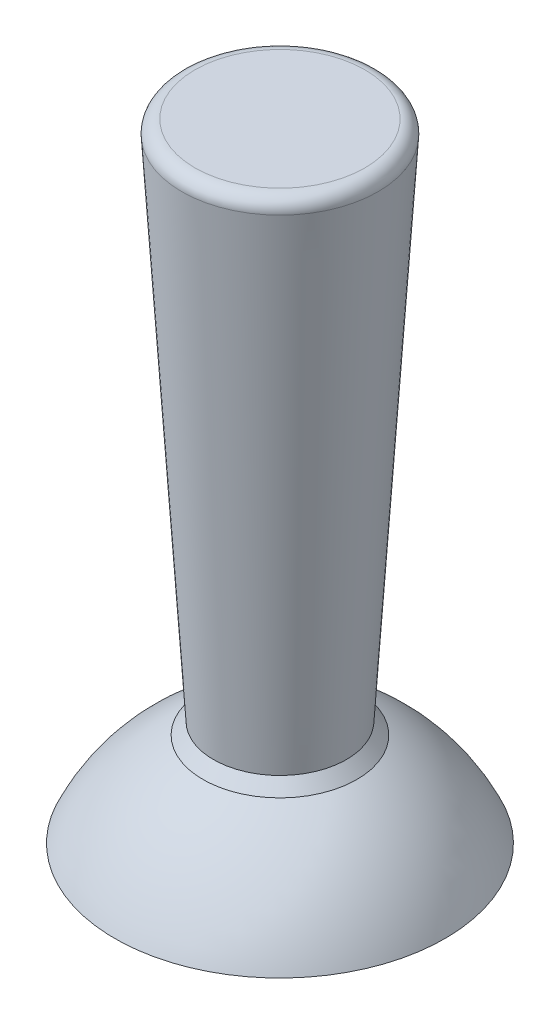
ISO-10303-21;
HEADER;
FILE_DESCRIPTION(('STEP AP214'),'2;1');
FILE_NAME('part.step','',(''),(''),'','','');
FILE_SCHEMA(('AUTOMOTIVE_DESIGN { 1 0 10303 214 1 1 1 1 }'));
ENDSEC;
DATA;
#1=APPLICATION_CONTEXT('core data for automotive mechanical design processes');
#2=APPLICATION_PROTOCOL_DEFINITION('international standard','automotive_design',2000,#1);
#3=PRODUCT_CONTEXT('',#1,'mechanical');
#4=PRODUCT('Part','Part','',(#3));
#5=PRODUCT_RELATED_PRODUCT_CATEGORY('part','',(#4));
#6=PRODUCT_DEFINITION_FORMATION('','',#4);
#7=PRODUCT_DEFINITION_CONTEXT('part definition',#1,'design');
#8=PRODUCT_DEFINITION('design','',#6,#7);
#9=PRODUCT_DEFINITION_SHAPE('','',#8);
#10=(LENGTH_UNIT() NAMED_UNIT(*) SI_UNIT(.MILLI.,.METRE.));
#11=(NAMED_UNIT(*) PLANE_ANGLE_UNIT() SI_UNIT($,.RADIAN.));
#12=(NAMED_UNIT(*) SI_UNIT($,.STERADIAN.) SOLID_ANGLE_UNIT());
#13=UNCERTAINTY_MEASURE_WITH_UNIT(LENGTH_MEASURE(1.E-05),#10,'distance_accuracy_value','');
#14=(GEOMETRIC_REPRESENTATION_CONTEXT(3) GLOBAL_UNCERTAINTY_ASSIGNED_CONTEXT((#13)) GLOBAL_UNIT_ASSIGNED_CONTEXT((#10,
#11,#12)) REPRESENTATION_CONTEXT('',''));
#15=CARTESIAN_POINT('',(0.,0.,0.));
#16=DIRECTION('',(0.,0.,1.));
#17=DIRECTION('',(1.,0.,0.));
#18=AXIS2_PLACEMENT_3D('',#15,#16,#17);
#19=CARTESIAN_POINT('',(0.,47.5,0.));
#20=DIRECTION('',(0.,1.,0.));
#21=DIRECTION('',(0.,0.,1.));
#22=AXIS2_PLACEMENT_3D('',#19,#20,#21);
#23=CONICAL_SURFACE('',#22,7.5,0.0624188099959573);
#24=CARTESIAN_POINT('',(0.,7.99902628924137,0.));
#25=DIRECTION('',(0.,-1.,0.));
#26=DIRECTION('',(0.,0.,-1.));
#27=AXIS2_PLACEMENT_3D('',#24,#25,#26);
#28=CIRCLE('',#27,5.03118914307759);
#29=CARTESIAN_POINT('',(0.,7.99902628924137,-5.03118914307759));
#30=VERTEX_POINT('',#29);
#31=EDGE_CURVE('E50',#30,#30,#28,.F.);
#32=ORIENTED_EDGE('',*,*,#31,.T.);
#33=EDGE_LOOP('',(#32));
#34=FACE_BOUND('',#33,.T.);
#35=CARTESIAN_POINT('',(0.,46.4376217138448,0.));
#36=DIRECTION('',(0.,-1.,0.));
#37=DIRECTION('',(0.,0.,-1.));
#38=AXIS2_PLACEMENT_3D('',#35,#36,#37);
#39=CIRCLE('',#38,7.4336013571153);
#40=CARTESIAN_POINT('',(0.,46.4376217138448,-7.4336013571153));
#41=VERTEX_POINT('',#40);
#42=EDGE_CURVE('E68',#41,#41,#39,.T.);
#43=ORIENTED_EDGE('',*,*,#42,.T.);
#44=EDGE_LOOP('',(#43));
#45=FACE_BOUND('',#44,.T.);
#46=ADVANCED_FACE('F37',(#34,#45),#23,.T.);
#47=CARTESIAN_POINT('',(0.,47.5,0.));
#48=DIRECTION('',(0.,-1.,0.));
#49=DIRECTION('',(0.,0.,-1.));
#50=AXIS2_PLACEMENT_3D('',#47,#48,#49);
#51=PLANE('',#50);
#52=CARTESIAN_POINT('',(0.,47.5,0.));
#53=DIRECTION('',(0.,-1.,0.));
#54=DIRECTION('',(0.,0.,-1.));
#55=AXIS2_PLACEMENT_3D('',#52,#53,#54);
#56=CIRCLE('',#55,6.43554877863241);
#57=CARTESIAN_POINT('',(0.,47.5,-6.43554877863241));
#58=VERTEX_POINT('',#57);
#59=EDGE_CURVE('E71',#58,#58,#56,.F.);
#60=ORIENTED_EDGE('',*,*,#59,.T.);
#61=EDGE_LOOP('',(#60));
#62=FACE_BOUND('',#61,.T.);
#63=ADVANCED_FACE('F91',(#62),#51,.F.);
#64=CARTESIAN_POINT('',(0.,-6.17156741649222,0.));
#65=DIRECTION('',(0.,-1.,0.));
#66=DIRECTION('',(0.,0.,-1.));
#67=AXIS2_PLACEMENT_3D('',#64,#65,#66);
#68=DEGENERATE_TOROIDAL_SURFACE('',#67,1.17156741649221,15.,.F.);
#69=CARTESIAN_POINT('',(0.,7.09445081458566,0.));
#70=DIRECTION('',(0.,-1.,0.));
#71=DIRECTION('',(0.,0.,-1.));
#72=AXIS2_PLACEMENT_3D('',#69,#70,#71);
#73=CIRCLE('',#72,5.82934397365617);
#74=CARTESIAN_POINT('',(0.,7.09445081458566,-5.82934397365617));
#75=VERTEX_POINT('',#74);
#76=EDGE_CURVE('E74',#75,#75,#73,.T.);
#77=ORIENTED_EDGE('',*,*,#76,.T.);
#78=EDGE_LOOP('',(#77));
#79=FACE_BOUND('',#78,.T.);
#80=CARTESIAN_POINT('',(0.,0.,0.));
#81=DIRECTION('',(0.,-1.,0.));
#82=DIRECTION('',(0.,0.,-1.));
#83=AXIS2_PLACEMENT_3D('',#80,#81,#82);
#84=CIRCLE('',#83,12.5);
#85=CARTESIAN_POINT('',(0.,0.,-12.5));
#86=VERTEX_POINT('',#85);
#87=EDGE_CURVE('E63',#86,#86,#84,.T.);
#88=ORIENTED_EDGE('',*,*,#87,.F.);
#89=EDGE_LOOP('',(#88));
#90=FACE_BOUND('',#89,.T.);
#91=ADVANCED_FACE('F87',(#79,#90),#68,.F.);
#92=CARTESIAN_POINT('',(0.,0.,0.));
#93=DIRECTION('',(0.,-1.,0.));
#94=DIRECTION('',(0.,0.,-1.));
#95=AXIS2_PLACEMENT_3D('',#92,#93,#94);
#96=PLANE('',#95);
#97=CARTESIAN_POINT('',(0.,0.,0.));
#98=DIRECTION('',(0.,-1.,0.));
#99=DIRECTION('',(0.,0.,-1.));
#100=AXIS2_PLACEMENT_3D('',#97,#98,#99);
#101=CIRCLE('',#100,11.3947270104139);
#102=CARTESIAN_POINT('',(0.,0.,-11.3947270104139));
#103=VERTEX_POINT('',#102);
#104=EDGE_CURVE('E58',#103,#103,#101,.T.);
#105=ORIENTED_EDGE('',*,*,#104,.F.);
#106=EDGE_LOOP('',(#105));
#107=FACE_BOUND('',#106,.T.);
#108=ORIENTED_EDGE('',*,*,#87,.T.);
#109=EDGE_LOOP('',(#108));
#110=FACE_BOUND('',#109,.T.);
#111=ADVANCED_FACE('F90',(#107,#110),#96,.T.);
#112=CARTESIAN_POINT('',(0.,6.5,0.));
#113=DIRECTION('',(0.,1.,0.));
#114=DIRECTION('',(0.,0.,1.));
#115=AXIS2_PLACEMENT_3D('',#112,#113,#114);
#116=PLANE('',#115);
#117=CARTESIAN_POINT('',(0.,6.5,0.));
#118=DIRECTION('',(0.,1.,0.));
#119=DIRECTION('',(0.,0.,1.));
#120=AXIS2_PLACEMENT_3D('',#117,#118,#119);
#121=CIRCLE('',#120,4.25);
#122=CARTESIAN_POINT('',(0.,6.5,4.25));
#123=VERTEX_POINT('',#122);
#124=EDGE_CURVE('E10',#123,#123,#121,.F.);
#125=ORIENTED_EDGE('',*,*,#124,.F.);
#126=EDGE_LOOP('',(#125));
#127=FACE_BOUND('',#126,.T.);
#128=CARTESIAN_POINT('',(0.,6.5,0.));
#129=DIRECTION('',(0.,1.,0.));
#130=DIRECTION('',(0.,0.,1.));
#131=AXIS2_PLACEMENT_3D('',#128,#129,#130);
#132=CIRCLE('',#131,4.7808589131059);
#133=CARTESIAN_POINT('',(0.,6.5,4.7808589131059));
#134=VERTEX_POINT('',#133);
#135=EDGE_CURVE('E60',#134,#134,#132,.F.);
#136=ORIENTED_EDGE('',*,*,#135,.T.);
#137=EDGE_LOOP('',(#136));
#138=FACE_BOUND('',#137,.T.);
#139=ADVANCED_FACE('F96',(#127,#138),#116,.F.);
#140=CARTESIAN_POINT('',(0.,-6.17156741649222,0.));
#141=DIRECTION('',(0.,-1.,0.));
#142=DIRECTION('',(0.,0.,-1.));
#143=AXIS2_PLACEMENT_3D('',#140,#141,#142);
#144=DEGENERATE_TOROIDAL_SURFACE('',#143,1.17156741649221,14.,.F.);
#145=ORIENTED_EDGE('',*,*,#135,.F.);
#146=EDGE_LOOP('',(#145));
#147=FACE_BOUND('',#146,.T.);
#148=ORIENTED_EDGE('',*,*,#104,.T.);
#149=EDGE_LOOP('',(#148));
#150=FACE_BOUND('',#149,.T.);
#151=ADVANCED_FACE('F102',(#147,#150),#144,.T.);
#152=CARTESIAN_POINT('',(0.,46.5,0.));
#153=DIRECTION('',(0.,-1.,0.));
#154=DIRECTION('',(0.,0.,-1.));
#155=AXIS2_PLACEMENT_3D('',#152,#153,#154);
#156=TOROIDAL_SURFACE('',#155,6.43554877863241,1.);
#157=ORIENTED_EDGE('',*,*,#59,.F.);
#158=EDGE_LOOP('',(#157));
#159=FACE_BOUND('',#158,.T.);
#160=ORIENTED_EDGE('',*,*,#42,.F.);
#161=EDGE_LOOP('',(#160));
#162=FACE_BOUND('',#161,.T.);
#163=ADVANCED_FACE('F84',(#159,#162),#156,.T.);
#164=CARTESIAN_POINT('',(0.,7.0944508145856,0.));
#165=DIRECTION('',(0.,-1.,0.));
#166=DIRECTION('',(0.,0.,-1.));
#167=AXIS2_PLACEMENT_3D('',#164,#165,#166);
#168=CONICAL_SURFACE('',#167,5.82934397365622,0.722979353401505);
#169=ORIENTED_EDGE('',*,*,#31,.F.);
#170=EDGE_LOOP('',(#169));
#171=FACE_BOUND('',#170,.T.);
#172=ORIENTED_EDGE('',*,*,#76,.F.);
#173=EDGE_LOOP('',(#172));
#174=FACE_BOUND('',#173,.T.);
#175=ADVANCED_FACE('F40',(#171,#174),#168,.T.);
#176=CARTESIAN_POINT('',(0.,4.5,0.));
#177=DIRECTION('',(0.,1.,0.));
#178=DIRECTION('',(-1.,0.,0.));
#179=AXIS2_PLACEMENT_3D('',#176,#177,#178);
#180=CONICAL_SURFACE('',#179,2.75,0.643501108793285);
#181=CARTESIAN_POINT('',(0.,4.5,0.));
#182=DIRECTION('',(0.,1.,0.));
#183=DIRECTION('',(-1.,0.,0.));
#184=AXIS2_PLACEMENT_3D('',#181,#182,#183);
#185=CIRCLE('',#184,2.75);
#186=CARTESIAN_POINT('',(-2.75,4.5,0.));
#187=VERTEX_POINT('',#186);
#188=EDGE_CURVE('E42',#187,#187,#185,.T.);
#189=ORIENTED_EDGE('',*,*,#188,.T.);
#190=EDGE_LOOP('',(#189));
#191=FACE_BOUND('',#190,.T.);
#192=ORIENTED_EDGE('',*,*,#124,.T.);
#193=EDGE_LOOP('',(#192));
#194=FACE_BOUND('',#193,.T.);
#195=ADVANCED_FACE('F83',(#191,#194),#180,.T.);
#196=CARTESIAN_POINT('',(0.,1.5,0.));
#197=DIRECTION('',(0.,-1.,0.));
#198=DIRECTION('',(0.,0.,-1.));
#199=AXIS2_PLACEMENT_3D('',#196,#197,#198);
#200=PLANE('',#199);
#201=CARTESIAN_POINT('',(0.,1.5,0.));
#202=DIRECTION('',(0.,-1.,0.));
#203=DIRECTION('',(1.,0.,0.));
#204=AXIS2_PLACEMENT_3D('',#201,#202,#203);
#205=ELLIPSE('',#204,2.2,1.7);
#206=CARTESIAN_POINT('',(2.2,1.5,0.));
#207=VERTEX_POINT('',#206);
#208=EDGE_CURVE('E53',#207,#207,#205,.T.);
#209=ORIENTED_EDGE('',*,*,#208,.F.);
#210=EDGE_LOOP('',(#209));
#211=FACE_BOUND('',#210,.T.);
#212=CARTESIAN_POINT('',(0.,1.5,0.));
#213=DIRECTION('',(0.,-1.,0.));
#214=DIRECTION('',(0.,0.,-1.));
#215=AXIS2_PLACEMENT_3D('',#212,#213,#214);
#216=CIRCLE('',#215,2.75);
#217=CARTESIAN_POINT('',(0.,1.5,-2.75));
#218=VERTEX_POINT('',#217);
#219=EDGE_CURVE('E55',#218,#218,#216,.T.);
#220=ORIENTED_EDGE('',*,*,#219,.T.);
#221=EDGE_LOOP('',(#220));
#222=FACE_BOUND('',#221,.T.);
#223=ADVANCED_FACE('F142',(#211,#222),#200,.T.);
#224=CARTESIAN_POINT('',(0.,7.5,0.));
#225=DIRECTION('',(0.,-1.,0.));
#226=DIRECTION('',(0.,0.,-1.));
#227=AXIS2_PLACEMENT_3D('',#224,#225,#226);
#228=CYLINDRICAL_SURFACE('',#227,2.75);
#229=ORIENTED_EDGE('',*,*,#219,.F.);
#230=EDGE_LOOP('',(#229));
#231=FACE_BOUND('',#230,.T.);
#232=ORIENTED_EDGE('',*,*,#188,.F.);
#233=EDGE_LOOP('',(#232));
#234=FACE_BOUND('',#233,.T.);
#235=ADVANCED_FACE('F151',(#231,#234),#228,.T.);
#236=CARTESIAN_POINT('',(0.,9.5,0.));
#237=DIRECTION('',(0.,-1.,0.));
#238=DIRECTION('',(1.,0.,0.));
#239=AXIS2_PLACEMENT_3D('',#236,#237,#238);
#240=ELLIPSE('',#239,2.2,1.7);
#241=DIRECTION('',(0.,-1.,0.));
#242=VECTOR('',#241,1.);
#243=SURFACE_OF_LINEAR_EXTRUSION('',#240,#242);
#244=CARTESIAN_POINT('',(2.2,9.5,0.));
#245=VERTEX_POINT('',#244);
#246=EDGE_CURVE('E59',#245,#245,#240,.T.);
#247=ORIENTED_EDGE('',*,*,#246,.F.);
#248=EDGE_LOOP('',(#247));
#249=FACE_BOUND('',#248,.T.);
#250=ORIENTED_EDGE('',*,*,#208,.T.);
#251=EDGE_LOOP('',(#250));
#252=FACE_BOUND('',#251,.T.);
#253=ADVANCED_FACE('F158',(#249,#252),#243,.F.);
#254=CARTESIAN_POINT('',(0.,9.5,0.));
#255=DIRECTION('',(0.,-1.,0.));
#256=DIRECTION('',(0.,0.,-1.));
#257=AXIS2_PLACEMENT_3D('',#254,#255,#256);
#258=PLANE('',#257);
#259=ORIENTED_EDGE('',*,*,#246,.T.);
#260=EDGE_LOOP('',(#259));
#261=FACE_BOUND('',#260,.T.);
#262=ADVANCED_FACE('F165',(#261),#258,.T.);
#263=CLOSED_SHELL('',(#46,#63,#91,#111,#139,#151,#163,#175,#195,#223,#235,#253,#262));
#264=MANIFOLD_SOLID_BREP('B2',#263);
#265=ADVANCED_BREP_SHAPE_REPRESENTATION('',(#18,#264),#14);
#266=SHAPE_DEFINITION_REPRESENTATION(#9,#265);
ENDSEC;
END-ISO-10303-21;
